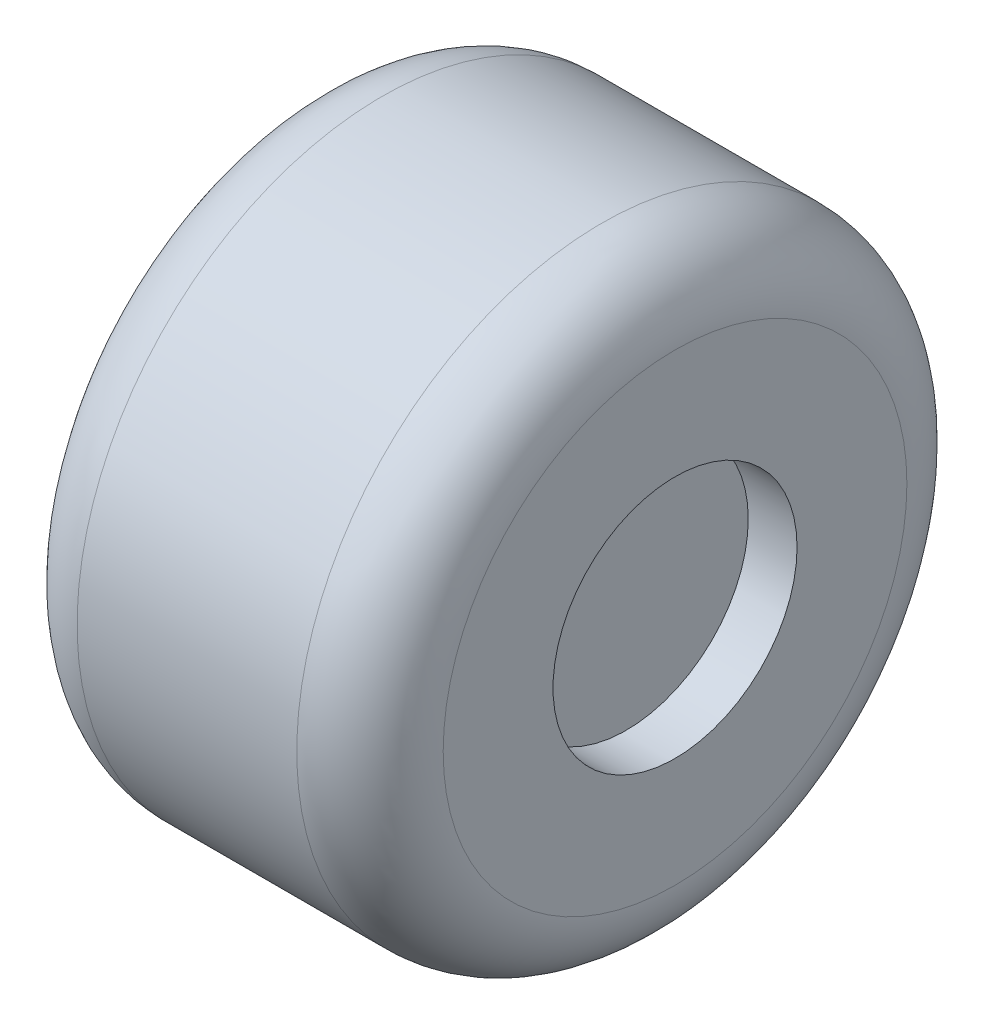
ISO-10303-21;
HEADER;
FILE_DESCRIPTION(('STEP AP214'),'2;1');
FILE_NAME('part.step','',(''),(''),'','','');
FILE_SCHEMA(('AUTOMOTIVE_DESIGN { 1 0 10303 214 1 1 1 1 }'));
ENDSEC;
DATA;
#1=APPLICATION_CONTEXT('core data for automotive mechanical design processes');
#2=APPLICATION_PROTOCOL_DEFINITION('international standard','automotive_design',2000,#1);
#3=PRODUCT_CONTEXT('',#1,'mechanical');
#4=PRODUCT('Part','Part','',(#3));
#5=PRODUCT_RELATED_PRODUCT_CATEGORY('part','',(#4));
#6=PRODUCT_DEFINITION_FORMATION('','',#4);
#7=PRODUCT_DEFINITION_CONTEXT('part definition',#1,'design');
#8=PRODUCT_DEFINITION('design','',#6,#7);
#9=PRODUCT_DEFINITION_SHAPE('','',#8);
#10=(LENGTH_UNIT() NAMED_UNIT(*) SI_UNIT(.MILLI.,.METRE.));
#11=(NAMED_UNIT(*) PLANE_ANGLE_UNIT() SI_UNIT($,.RADIAN.));
#12=(NAMED_UNIT(*) SI_UNIT($,.STERADIAN.) SOLID_ANGLE_UNIT());
#13=UNCERTAINTY_MEASURE_WITH_UNIT(LENGTH_MEASURE(1.E-05),#10,'distance_accuracy_value','');
#14=(GEOMETRIC_REPRESENTATION_CONTEXT(3) GLOBAL_UNCERTAINTY_ASSIGNED_CONTEXT((#13)) GLOBAL_UNIT_ASSIGNED_CONTEXT((#10,
#11,#12)) REPRESENTATION_CONTEXT('',''));
#15=CARTESIAN_POINT('',(0.,0.,0.));
#16=DIRECTION('',(0.,0.,1.));
#17=DIRECTION('',(1.,0.,0.));
#18=AXIS2_PLACEMENT_3D('',#15,#16,#17);
#19=CARTESIAN_POINT('',(75.,0.,0.));
#20=DIRECTION('',(-1.,0.,0.));
#21=DIRECTION('',(0.,0.,1.));
#22=AXIS2_PLACEMENT_3D('',#19,#20,#21);
#23=CYLINDRICAL_SURFACE('',#22,125.);
#24=CARTESIAN_POINT('',(-45.,0.,0.));
#25=DIRECTION('',(1.,0.,0.));
#26=DIRECTION('',(0.,0.,-1.));
#27=AXIS2_PLACEMENT_3D('',#24,#25,#26);
#28=CIRCLE('',#27,125.);
#29=CARTESIAN_POINT('',(-45.,0.,-125.));
#30=VERTEX_POINT('',#29);
#31=EDGE_CURVE('E44',#30,#30,#28,.T.);
#32=ORIENTED_EDGE('',*,*,#31,.T.);
#33=EDGE_LOOP('',(#32));
#34=FACE_BOUND('',#33,.T.);
#35=CARTESIAN_POINT('',(45.,0.,0.));
#36=DIRECTION('',(1.,0.,0.));
#37=DIRECTION('',(0.,0.,-1.));
#38=AXIS2_PLACEMENT_3D('',#35,#36,#37);
#39=CIRCLE('',#38,125.);
#40=CARTESIAN_POINT('',(45.,0.,-125.));
#41=VERTEX_POINT('',#40);
#42=EDGE_CURVE('E48',#41,#41,#39,.F.);
#43=ORIENTED_EDGE('',*,*,#42,.T.);
#44=EDGE_LOOP('',(#43));
#45=FACE_BOUND('',#44,.T.);
#46=ADVANCED_FACE('F33',(#34,#45),#23,.T.);
#47=CARTESIAN_POINT('',(75.,0.,0.));
#48=DIRECTION('',(1.,0.,0.));
#49=DIRECTION('',(0.,0.,-1.));
#50=AXIS2_PLACEMENT_3D('',#47,#48,#49);
#51=PLANE('',#50);
#52=CARTESIAN_POINT('',(75.,0.,0.));
#53=DIRECTION('',(1.,0.,0.));
#54=DIRECTION('',(0.,0.,-1.));
#55=AXIS2_PLACEMENT_3D('',#52,#53,#54);
#56=CIRCLE('',#55,50.);
#57=CARTESIAN_POINT('',(75.,0.,-50.));
#58=VERTEX_POINT('',#57);
#59=EDGE_CURVE('E54',#58,#58,#56,.T.);
#60=ORIENTED_EDGE('',*,*,#59,.F.);
#61=EDGE_LOOP('',(#60));
#62=FACE_BOUND('',#61,.T.);
#63=CARTESIAN_POINT('',(75.,0.,0.));
#64=DIRECTION('',(1.,0.,0.));
#65=DIRECTION('',(0.,0.,-1.));
#66=AXIS2_PLACEMENT_3D('',#63,#64,#65);
#67=CIRCLE('',#66,95.);
#68=CARTESIAN_POINT('',(75.,0.,-95.));
#69=VERTEX_POINT('',#68);
#70=EDGE_CURVE('E10',#69,#69,#67,.T.);
#71=ORIENTED_EDGE('',*,*,#70,.T.);
#72=EDGE_LOOP('',(#71));
#73=FACE_BOUND('',#72,.T.);
#74=ADVANCED_FACE('F78',(#62,#73),#51,.T.);
#75=CARTESIAN_POINT('',(-75.,0.,0.));
#76=DIRECTION('',(1.,0.,0.));
#77=DIRECTION('',(0.,0.,-1.));
#78=AXIS2_PLACEMENT_3D('',#75,#76,#77);
#79=PLANE('',#78);
#80=CARTESIAN_POINT('',(-75.,0.,0.));
#81=DIRECTION('',(-1.,0.,0.));
#82=DIRECTION('',(0.,0.,1.));
#83=AXIS2_PLACEMENT_3D('',#80,#81,#82);
#84=CIRCLE('',#83,30.);
#85=CARTESIAN_POINT('',(-75.,0.,30.));
#86=VERTEX_POINT('',#85);
#87=EDGE_CURVE('E60',#86,#86,#84,.T.);
#88=ORIENTED_EDGE('',*,*,#87,.F.);
#89=EDGE_LOOP('',(#88));
#90=FACE_BOUND('',#89,.T.);
#91=CARTESIAN_POINT('',(-75.,0.,0.));
#92=DIRECTION('',(1.,0.,0.));
#93=DIRECTION('',(0.,0.,-1.));
#94=AXIS2_PLACEMENT_3D('',#91,#92,#93);
#95=CIRCLE('',#94,95.);
#96=CARTESIAN_POINT('',(-75.,0.,-95.));
#97=VERTEX_POINT('',#96);
#98=EDGE_CURVE('E40',#97,#97,#95,.F.);
#99=ORIENTED_EDGE('',*,*,#98,.T.);
#100=EDGE_LOOP('',(#99));
#101=FACE_BOUND('',#100,.T.);
#102=ADVANCED_FACE('F75',(#90,#101),#79,.F.);
#103=CARTESIAN_POINT('',(-45.,0.,0.));
#104=DIRECTION('',(1.,0.,0.));
#105=DIRECTION('',(0.,0.,-1.));
#106=AXIS2_PLACEMENT_3D('',#103,#104,#105);
#107=TOROIDAL_SURFACE('',#106,95.,30.);
#108=ORIENTED_EDGE('',*,*,#98,.F.);
#109=EDGE_LOOP('',(#108));
#110=FACE_BOUND('',#109,.T.);
#111=ORIENTED_EDGE('',*,*,#31,.F.);
#112=EDGE_LOOP('',(#111));
#113=FACE_BOUND('',#112,.T.);
#114=ADVANCED_FACE('F77',(#110,#113),#107,.T.);
#115=CARTESIAN_POINT('',(45.,0.,0.));
#116=DIRECTION('',(1.,0.,0.));
#117=DIRECTION('',(0.,0.,-1.));
#118=AXIS2_PLACEMENT_3D('',#115,#116,#117);
#119=TOROIDAL_SURFACE('',#118,95.,30.);
#120=ORIENTED_EDGE('',*,*,#42,.F.);
#121=EDGE_LOOP('',(#120));
#122=FACE_BOUND('',#121,.T.);
#123=ORIENTED_EDGE('',*,*,#70,.F.);
#124=EDGE_LOOP('',(#123));
#125=FACE_BOUND('',#124,.T.);
#126=ADVANCED_FACE('F35',(#122,#125),#119,.T.);
#127=CARTESIAN_POINT('',(55.,0.,0.));
#128=DIRECTION('',(1.,0.,0.));
#129=DIRECTION('',(0.,0.,-1.));
#130=AXIS2_PLACEMENT_3D('',#127,#128,#129);
#131=CYLINDRICAL_SURFACE('',#130,50.);
#132=CARTESIAN_POINT('',(55.,0.,0.));
#133=DIRECTION('',(1.,0.,0.));
#134=DIRECTION('',(0.,0.,-1.));
#135=AXIS2_PLACEMENT_3D('',#132,#133,#134);
#136=CIRCLE('',#135,50.);
#137=CARTESIAN_POINT('',(55.,0.,-50.));
#138=VERTEX_POINT('',#137);
#139=EDGE_CURVE('E53',#138,#138,#136,.T.);
#140=ORIENTED_EDGE('',*,*,#139,.F.);
#141=EDGE_LOOP('',(#140));
#142=FACE_BOUND('',#141,.T.);
#143=ORIENTED_EDGE('',*,*,#59,.T.);
#144=EDGE_LOOP('',(#143));
#145=FACE_BOUND('',#144,.T.);
#146=ADVANCED_FACE('F98',(#142,#145),#131,.F.);
#147=CARTESIAN_POINT('',(55.,0.,0.));
#148=DIRECTION('',(1.,0.,0.));
#149=DIRECTION('',(0.,0.,-1.));
#150=AXIS2_PLACEMENT_3D('',#147,#148,#149);
#151=PLANE('',#150);
#152=ORIENTED_EDGE('',*,*,#139,.T.);
#153=EDGE_LOOP('',(#152));
#154=FACE_BOUND('',#153,.T.);
#155=ADVANCED_FACE('F71',(#154),#151,.T.);
#156=CARTESIAN_POINT('',(-25.,0.,0.));
#157=DIRECTION('',(-1.,0.,0.));
#158=DIRECTION('',(0.,0.,1.));
#159=AXIS2_PLACEMENT_3D('',#156,#157,#158);
#160=CYLINDRICAL_SURFACE('',#159,30.);
#161=CARTESIAN_POINT('',(-25.,0.,0.));
#162=DIRECTION('',(-1.,0.,0.));
#163=DIRECTION('',(0.,0.,1.));
#164=AXIS2_PLACEMENT_3D('',#161,#162,#163);
#165=CIRCLE('',#164,30.);
#166=CARTESIAN_POINT('',(-25.,0.,30.));
#167=VERTEX_POINT('',#166);
#168=EDGE_CURVE('E57',#167,#167,#165,.T.);
#169=ORIENTED_EDGE('',*,*,#168,.F.);
#170=EDGE_LOOP('',(#169));
#171=FACE_BOUND('',#170,.T.);
#172=ORIENTED_EDGE('',*,*,#87,.T.);
#173=EDGE_LOOP('',(#172));
#174=FACE_BOUND('',#173,.T.);
#175=ADVANCED_FACE('F68',(#171,#174),#160,.F.);
#176=CARTESIAN_POINT('',(-25.,0.,0.));
#177=DIRECTION('',(-1.,0.,0.));
#178=DIRECTION('',(0.,0.,1.));
#179=AXIS2_PLACEMENT_3D('',#176,#177,#178);
#180=PLANE('',#179);
#181=ORIENTED_EDGE('',*,*,#168,.T.);
#182=EDGE_LOOP('',(#181));
#183=FACE_BOUND('',#182,.T.);
#184=ADVANCED_FACE('F66',(#183),#180,.T.);
#185=CLOSED_SHELL('',(#46,#74,#102,#114,#126,#146,#155,#175,#184));
#186=MANIFOLD_SOLID_BREP('B2',#185);
#187=ADVANCED_BREP_SHAPE_REPRESENTATION('',(#18,#186),#14);
#188=SHAPE_DEFINITION_REPRESENTATION(#9,#187);
ENDSEC;
END-ISO-10303-21;
